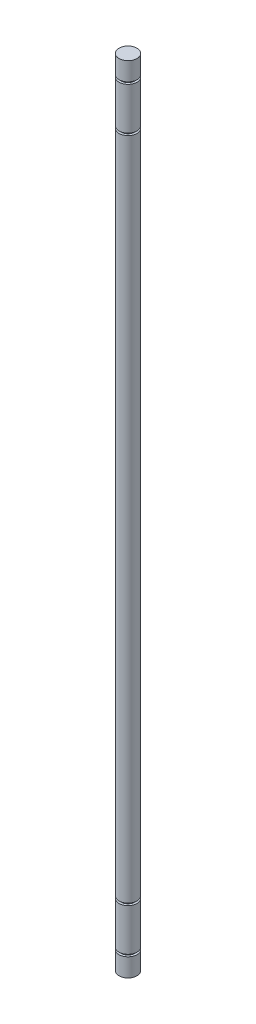
ISO-10303-21;
HEADER;
FILE_DESCRIPTION(('STEP AP214'),'2;1');
FILE_NAME('part.step','',(''),(''),'','','');
FILE_SCHEMA(('AUTOMOTIVE_DESIGN { 1 0 10303 214 1 1 1 1 }'));
ENDSEC;
DATA;
#1=APPLICATION_CONTEXT('core data for automotive mechanical design processes');
#2=APPLICATION_PROTOCOL_DEFINITION('international standard','automotive_design',2000,#1);
#3=PRODUCT_CONTEXT('',#1,'mechanical');
#4=PRODUCT('Part','Part','',(#3));
#5=PRODUCT_RELATED_PRODUCT_CATEGORY('part','',(#4));
#6=PRODUCT_DEFINITION_FORMATION('','',#4);
#7=PRODUCT_DEFINITION_CONTEXT('part definition',#1,'design');
#8=PRODUCT_DEFINITION('design','',#6,#7);
#9=PRODUCT_DEFINITION_SHAPE('','',#8);
#10=(LENGTH_UNIT() NAMED_UNIT(*) SI_UNIT(.MILLI.,.METRE.));
#11=(NAMED_UNIT(*) PLANE_ANGLE_UNIT() SI_UNIT($,.RADIAN.));
#12=(NAMED_UNIT(*) SI_UNIT($,.STERADIAN.) SOLID_ANGLE_UNIT());
#13=UNCERTAINTY_MEASURE_WITH_UNIT(LENGTH_MEASURE(1.E-05),#10,'distance_accuracy_value','');
#14=(GEOMETRIC_REPRESENTATION_CONTEXT(3) GLOBAL_UNCERTAINTY_ASSIGNED_CONTEXT((#13)) GLOBAL_UNIT_ASSIGNED_CONTEXT((#10,
#11,#12)) REPRESENTATION_CONTEXT('',''));
#15=CARTESIAN_POINT('',(0.,0.,0.));
#16=DIRECTION('',(0.,0.,1.));
#17=DIRECTION('',(1.,0.,0.));
#18=AXIS2_PLACEMENT_3D('',#15,#16,#17);
#19=CARTESIAN_POINT('',(0.,70.0659,0.));
#20=DIRECTION('',(0.,-1.,0.));
#21=DIRECTION('',(0.,0.,-1.));
#22=AXIS2_PLACEMENT_3D('',#19,#20,#21);
#23=CYLINDRICAL_SURFACE('',#22,1.5875);
#24=CARTESIAN_POINT('',(0.,-66.8274,0.));
#25=DIRECTION('',(0.,-1.,0.));
#26=DIRECTION('',(0.,0.,-1.));
#27=AXIS2_PLACEMENT_3D('',#24,#25,#26);
#28=CIRCLE('',#27,1.5875);
#29=CARTESIAN_POINT('',(0.,-66.8274,-1.5875));
#30=VERTEX_POINT('',#29);
#31=EDGE_CURVE('E77',#30,#30,#28,.T.);
#32=ORIENTED_EDGE('',*,*,#31,.T.);
#33=EDGE_LOOP('',(#32));
#34=FACE_BOUND('',#33,.T.);
#35=CARTESIAN_POINT('',(0.,-70.0659,0.));
#36=DIRECTION('',(0.,1.,0.));
#37=DIRECTION('',(0.,0.,1.));
#38=AXIS2_PLACEMENT_3D('',#35,#36,#37);
#39=CIRCLE('',#38,1.5875);
#40=CARTESIAN_POINT('',(0.,-70.0659,1.5875));
#41=VERTEX_POINT('',#40);
#42=EDGE_CURVE('E45',#41,#41,#39,.T.);
#43=ORIENTED_EDGE('',*,*,#42,.T.);
#44=EDGE_LOOP('',(#43));
#45=FACE_BOUND('',#44,.T.);
#46=ADVANCED_FACE('F41',(#34,#45),#23,.T.);
#47=CARTESIAN_POINT('',(0.,-70.0659,0.));
#48=DIRECTION('',(0.,1.,0.));
#49=DIRECTION('',(0.,0.,1.));
#50=AXIS2_PLACEMENT_3D('',#47,#48,#49);
#51=PLANE('',#50);
#52=ORIENTED_EDGE('',*,*,#42,.F.);
#53=EDGE_LOOP('',(#52));
#54=FACE_BOUND('',#53,.T.);
#55=ADVANCED_FACE('F167',(#54),#51,.F.);
#56=CARTESIAN_POINT('',(0.,-58.6232,0.));
#57=DIRECTION('',(0.,-1.,0.));
#58=DIRECTION('',(0.,0.,-1.));
#59=AXIS2_PLACEMENT_3D('',#56,#57,#58);
#60=CYLINDRICAL_SURFACE('',#59,1.2065);
#61=CARTESIAN_POINT('',(0.,-66.8274,0.));
#62=DIRECTION('',(0.,-1.,0.));
#63=DIRECTION('',(0.,0.,-1.));
#64=AXIS2_PLACEMENT_3D('',#61,#62,#63);
#65=CIRCLE('',#64,1.2065);
#66=CARTESIAN_POINT('',(0.,-66.8274,-1.2065));
#67=VERTEX_POINT('',#66);
#68=EDGE_CURVE('E72',#67,#67,#65,.T.);
#69=ORIENTED_EDGE('',*,*,#68,.F.);
#70=EDGE_LOOP('',(#69));
#71=FACE_BOUND('',#70,.T.);
#72=CARTESIAN_POINT('',(0.,-66.4464,0.));
#73=DIRECTION('',(0.,-1.,0.));
#74=DIRECTION('',(0.,0.,-1.));
#75=AXIS2_PLACEMENT_3D('',#72,#73,#74);
#76=CIRCLE('',#75,1.2065);
#77=CARTESIAN_POINT('',(0.,-66.4464,-1.2065));
#78=VERTEX_POINT('',#77);
#79=EDGE_CURVE('E85',#78,#78,#76,.T.);
#80=ORIENTED_EDGE('',*,*,#79,.T.);
#81=EDGE_LOOP('',(#80));
#82=FACE_BOUND('',#81,.T.);
#83=ADVANCED_FACE('F172',(#71,#82),#60,.T.);
#84=CARTESIAN_POINT('',(1.2065,-66.8274,0.));
#85=DIRECTION('',(0.,-1.,0.));
#86=DIRECTION('',(0.,0.,-1.));
#87=AXIS2_PLACEMENT_3D('',#84,#85,#86);
#88=PLANE('',#87);
#89=ORIENTED_EDGE('',*,*,#31,.F.);
#90=EDGE_LOOP('',(#89));
#91=FACE_BOUND('',#90,.T.);
#92=ORIENTED_EDGE('',*,*,#68,.T.);
#93=EDGE_LOOP('',(#92));
#94=FACE_BOUND('',#93,.T.);
#95=ADVANCED_FACE('F200',(#91,#94),#88,.F.);
#96=CARTESIAN_POINT('',(1.2065,-66.4464,0.));
#97=DIRECTION('',(0.,1.,0.));
#98=DIRECTION('',(0.,0.,1.));
#99=AXIS2_PLACEMENT_3D('',#96,#97,#98);
#100=PLANE('',#99);
#101=ORIENTED_EDGE('',*,*,#79,.F.);
#102=EDGE_LOOP('',(#101));
#103=FACE_BOUND('',#102,.T.);
#104=CARTESIAN_POINT('',(0.,-66.4464,0.));
#105=DIRECTION('',(0.,-1.,0.));
#106=DIRECTION('',(0.,0.,-1.));
#107=AXIS2_PLACEMENT_3D('',#104,#105,#106);
#108=CIRCLE('',#107,1.5875);
#109=CARTESIAN_POINT('',(0.,-66.4464,-1.5875));
#110=VERTEX_POINT('',#109);
#111=EDGE_CURVE('E81',#110,#110,#108,.T.);
#112=ORIENTED_EDGE('',*,*,#111,.T.);
#113=EDGE_LOOP('',(#112));
#114=FACE_BOUND('',#113,.T.);
#115=ADVANCED_FACE('F164',(#103,#114),#100,.F.);
#116=ORIENTED_EDGE('',*,*,#111,.F.);
#117=EDGE_LOOP('',(#116));
#118=FACE_BOUND('',#117,.T.);
#119=CARTESIAN_POINT('',(0.,-59.0042,0.));
#120=DIRECTION('',(0.,-1.,0.));
#121=DIRECTION('',(0.,0.,-1.));
#122=AXIS2_PLACEMENT_3D('',#119,#120,#121);
#123=CIRCLE('',#122,1.5875);
#124=CARTESIAN_POINT('',(0.,-59.0042,-1.5875));
#125=VERTEX_POINT('',#124);
#126=EDGE_CURVE('E108',#125,#125,#123,.T.);
#127=ORIENTED_EDGE('',*,*,#126,.T.);
#128=EDGE_LOOP('',(#127));
#129=FACE_BOUND('',#128,.T.);
#130=ADVANCED_FACE('F133',(#118,#129),#23,.T.);
#131=CARTESIAN_POINT('',(0.,-58.6232,0.));
#132=DIRECTION('',(0.,-1.,0.));
#133=DIRECTION('',(0.,0.,-1.));
#134=AXIS2_PLACEMENT_3D('',#131,#132,#133);
#135=CYLINDRICAL_SURFACE('',#134,1.2065);
#136=CARTESIAN_POINT('',(0.,-59.0042,0.));
#137=DIRECTION('',(0.,-1.,0.));
#138=DIRECTION('',(0.,0.,-1.));
#139=AXIS2_PLACEMENT_3D('',#136,#137,#138);
#140=CIRCLE('',#139,1.2065);
#141=CARTESIAN_POINT('',(0.,-59.0042,-1.2065));
#142=VERTEX_POINT('',#141);
#143=EDGE_CURVE('E71',#142,#142,#140,.T.);
#144=ORIENTED_EDGE('',*,*,#143,.F.);
#145=EDGE_LOOP('',(#144));
#146=FACE_BOUND('',#145,.T.);
#147=CARTESIAN_POINT('',(0.,-58.6232,0.));
#148=DIRECTION('',(0.,-1.,0.));
#149=DIRECTION('',(0.,0.,-1.));
#150=AXIS2_PLACEMENT_3D('',#147,#148,#149);
#151=CIRCLE('',#150,1.2065);
#152=CARTESIAN_POINT('',(0.,-58.6232,-1.2065));
#153=VERTEX_POINT('',#152);
#154=EDGE_CURVE('E93',#153,#153,#151,.T.);
#155=ORIENTED_EDGE('',*,*,#154,.T.);
#156=EDGE_LOOP('',(#155));
#157=FACE_BOUND('',#156,.T.);
#158=ADVANCED_FACE('F120',(#146,#157),#135,.T.);
#159=CARTESIAN_POINT('',(1.2065,-59.0042,0.));
#160=DIRECTION('',(0.,-1.,0.));
#161=DIRECTION('',(0.,0.,-1.));
#162=AXIS2_PLACEMENT_3D('',#159,#160,#161);
#163=PLANE('',#162);
#164=ORIENTED_EDGE('',*,*,#126,.F.);
#165=EDGE_LOOP('',(#164));
#166=FACE_BOUND('',#165,.T.);
#167=ORIENTED_EDGE('',*,*,#143,.T.);
#168=EDGE_LOOP('',(#167));
#169=FACE_BOUND('',#168,.T.);
#170=ADVANCED_FACE('F126',(#166,#169),#163,.F.);
#171=CARTESIAN_POINT('',(1.2065,-58.6232,0.));
#172=DIRECTION('',(0.,1.,0.));
#173=DIRECTION('',(0.,0.,1.));
#174=AXIS2_PLACEMENT_3D('',#171,#172,#173);
#175=PLANE('',#174);
#176=ORIENTED_EDGE('',*,*,#154,.F.);
#177=EDGE_LOOP('',(#176));
#178=FACE_BOUND('',#177,.T.);
#179=CARTESIAN_POINT('',(0.,-58.6232,0.));
#180=DIRECTION('',(0.,-1.,0.));
#181=DIRECTION('',(0.,0.,-1.));
#182=AXIS2_PLACEMENT_3D('',#179,#180,#181);
#183=CIRCLE('',#182,1.5875);
#184=CARTESIAN_POINT('',(0.,-58.6232,-1.5875));
#185=VERTEX_POINT('',#184);
#186=EDGE_CURVE('E112',#185,#185,#183,.T.);
#187=ORIENTED_EDGE('',*,*,#186,.T.);
#188=EDGE_LOOP('',(#187));
#189=FACE_BOUND('',#188,.T.);
#190=ADVANCED_FACE('F122',(#178,#189),#175,.F.);
#191=ORIENTED_EDGE('',*,*,#186,.F.);
#192=EDGE_LOOP('',(#191));
#193=FACE_BOUND('',#192,.T.);
#194=CARTESIAN_POINT('',(0.,58.6232,0.));
#195=DIRECTION('',(0.,-1.,0.));
#196=DIRECTION('',(0.,0.,-1.));
#197=AXIS2_PLACEMENT_3D('',#194,#195,#196);
#198=CIRCLE('',#197,1.5875);
#199=CARTESIAN_POINT('',(0.,58.6232,-1.5875));
#200=VERTEX_POINT('',#199);
#201=EDGE_CURVE('E59',#200,#200,#198,.T.);
#202=ORIENTED_EDGE('',*,*,#201,.T.);
#203=EDGE_LOOP('',(#202));
#204=FACE_BOUND('',#203,.T.);
#205=ADVANCED_FACE('F125',(#193,#204),#23,.T.);
#206=CARTESIAN_POINT('',(0.,-58.6232,0.));
#207=DIRECTION('',(0.,-1.,0.));
#208=DIRECTION('',(0.,0.,-1.));
#209=AXIS2_PLACEMENT_3D('',#206,#207,#208);
#210=CYLINDRICAL_SURFACE('',#209,1.20649999999999);
#211=CARTESIAN_POINT('',(0.,58.6232,0.));
#212=DIRECTION('',(0.,-1.,0.));
#213=DIRECTION('',(0.,0.,-1.));
#214=AXIS2_PLACEMENT_3D('',#211,#212,#213);
#215=CIRCLE('',#214,1.20649999999999);
#216=CARTESIAN_POINT('',(0.,58.6232,-1.20649999999999));
#217=VERTEX_POINT('',#216);
#218=EDGE_CURVE('E54',#217,#217,#215,.T.);
#219=ORIENTED_EDGE('',*,*,#218,.F.);
#220=EDGE_LOOP('',(#219));
#221=FACE_BOUND('',#220,.T.);
#222=CARTESIAN_POINT('',(0.,59.0042,0.));
#223=DIRECTION('',(0.,-1.,0.));
#224=DIRECTION('',(0.,0.,-1.));
#225=AXIS2_PLACEMENT_3D('',#222,#223,#224);
#226=CIRCLE('',#225,1.20649999999999);
#227=CARTESIAN_POINT('',(0.,59.0042,-1.20649999999999));
#228=VERTEX_POINT('',#227);
#229=EDGE_CURVE('E67',#228,#228,#226,.T.);
#230=ORIENTED_EDGE('',*,*,#229,.T.);
#231=EDGE_LOOP('',(#230));
#232=FACE_BOUND('',#231,.T.);
#233=ADVANCED_FACE('F132',(#221,#232),#210,.T.);
#234=CARTESIAN_POINT('',(1.20649999999999,58.6232,0.));
#235=DIRECTION('',(0.,-1.,0.));
#236=DIRECTION('',(0.,0.,-1.));
#237=AXIS2_PLACEMENT_3D('',#234,#235,#236);
#238=PLANE('',#237);
#239=ORIENTED_EDGE('',*,*,#201,.F.);
#240=EDGE_LOOP('',(#239));
#241=FACE_BOUND('',#240,.T.);
#242=ORIENTED_EDGE('',*,*,#218,.T.);
#243=EDGE_LOOP('',(#242));
#244=FACE_BOUND('',#243,.T.);
#245=ADVANCED_FACE('F136',(#241,#244),#238,.F.);
#246=CARTESIAN_POINT('',(1.20649999999999,59.0042,0.));
#247=DIRECTION('',(0.,1.,0.));
#248=DIRECTION('',(0.,0.,1.));
#249=AXIS2_PLACEMENT_3D('',#246,#247,#248);
#250=PLANE('',#249);
#251=ORIENTED_EDGE('',*,*,#229,.F.);
#252=EDGE_LOOP('',(#251));
#253=FACE_BOUND('',#252,.T.);
#254=CARTESIAN_POINT('',(0.,59.0042,0.));
#255=DIRECTION('',(0.,-1.,0.));
#256=DIRECTION('',(0.,0.,-1.));
#257=AXIS2_PLACEMENT_3D('',#254,#255,#256);
#258=CIRCLE('',#257,1.5875);
#259=CARTESIAN_POINT('',(0.,59.0042,-1.5875));
#260=VERTEX_POINT('',#259);
#261=EDGE_CURVE('E63',#260,#260,#258,.T.);
#262=ORIENTED_EDGE('',*,*,#261,.T.);
#263=EDGE_LOOP('',(#262));
#264=FACE_BOUND('',#263,.T.);
#265=ADVANCED_FACE('F139',(#253,#264),#250,.F.);
#266=CARTESIAN_POINT('',(0.,66.4464,0.));
#267=DIRECTION('',(0.,-1.,0.));
#268=DIRECTION('',(0.,0.,-1.));
#269=AXIS2_PLACEMENT_3D('',#266,#267,#268);
#270=CIRCLE('',#269,1.5875);
#271=CARTESIAN_POINT('',(0.,66.4464,-1.5875));
#272=VERTEX_POINT('',#271);
#273=EDGE_CURVE('E94',#272,#272,#270,.T.);
#274=ORIENTED_EDGE('',*,*,#273,.T.);
#275=EDGE_LOOP('',(#274));
#276=FACE_BOUND('',#275,.T.);
#277=ORIENTED_EDGE('',*,*,#261,.F.);
#278=EDGE_LOOP('',(#277));
#279=FACE_BOUND('',#278,.T.);
#280=ADVANCED_FACE('F150',(#276,#279),#23,.T.);
#281=CARTESIAN_POINT('',(0.,-58.6232,0.));
#282=DIRECTION('',(0.,-1.,0.));
#283=DIRECTION('',(0.,0.,-1.));
#284=AXIS2_PLACEMENT_3D('',#281,#282,#283);
#285=CYLINDRICAL_SURFACE('',#284,1.20649999999998);
#286=CARTESIAN_POINT('',(0.,66.4464,0.));
#287=DIRECTION('',(0.,-1.,0.));
#288=DIRECTION('',(0.,0.,-1.));
#289=AXIS2_PLACEMENT_3D('',#286,#287,#288);
#290=CIRCLE('',#289,1.20649999999998);
#291=CARTESIAN_POINT('',(0.,66.4464,-1.20649999999998));
#292=VERTEX_POINT('',#291);
#293=EDGE_CURVE('E89',#292,#292,#290,.T.);
#294=ORIENTED_EDGE('',*,*,#293,.F.);
#295=EDGE_LOOP('',(#294));
#296=FACE_BOUND('',#295,.T.);
#297=CARTESIAN_POINT('',(0.,66.8274,0.));
#298=DIRECTION('',(0.,-1.,0.));
#299=DIRECTION('',(0.,0.,-1.));
#300=AXIS2_PLACEMENT_3D('',#297,#298,#299);
#301=CIRCLE('',#300,1.20649999999998);
#302=CARTESIAN_POINT('',(0.,66.8274,-1.20649999999998));
#303=VERTEX_POINT('',#302);
#304=EDGE_CURVE('E76',#303,#303,#301,.T.);
#305=ORIENTED_EDGE('',*,*,#304,.T.);
#306=EDGE_LOOP('',(#305));
#307=FACE_BOUND('',#306,.T.);
#308=ADVANCED_FACE('F155',(#296,#307),#285,.T.);
#309=CARTESIAN_POINT('',(1.20649999999998,66.4464,0.));
#310=DIRECTION('',(0.,-1.,0.));
#311=DIRECTION('',(0.,0.,-1.));
#312=AXIS2_PLACEMENT_3D('',#309,#310,#311);
#313=PLANE('',#312);
#314=ORIENTED_EDGE('',*,*,#273,.F.);
#315=EDGE_LOOP('',(#314));
#316=FACE_BOUND('',#315,.T.);
#317=ORIENTED_EDGE('',*,*,#293,.T.);
#318=EDGE_LOOP('',(#317));
#319=FACE_BOUND('',#318,.T.);
#320=ADVANCED_FACE('F160',(#316,#319),#313,.F.);
#321=CARTESIAN_POINT('',(1.20649999999998,66.8274,0.));
#322=DIRECTION('',(0.,1.,0.));
#323=DIRECTION('',(0.,0.,1.));
#324=AXIS2_PLACEMENT_3D('',#321,#322,#323);
#325=PLANE('',#324);
#326=ORIENTED_EDGE('',*,*,#304,.F.);
#327=EDGE_LOOP('',(#326));
#328=FACE_BOUND('',#327,.T.);
#329=CARTESIAN_POINT('',(0.,66.8274,0.));
#330=DIRECTION('',(0.,-1.,0.));
#331=DIRECTION('',(0.,0.,-1.));
#332=AXIS2_PLACEMENT_3D('',#329,#330,#331);
#333=CIRCLE('',#332,1.5875);
#334=CARTESIAN_POINT('',(0.,66.8274,-1.5875));
#335=VERTEX_POINT('',#334);
#336=EDGE_CURVE('E98',#335,#335,#333,.T.);
#337=ORIENTED_EDGE('',*,*,#336,.T.);
#338=EDGE_LOOP('',(#337));
#339=FACE_BOUND('',#338,.T.);
#340=ADVANCED_FACE('F181',(#328,#339),#325,.F.);
#341=CARTESIAN_POINT('',(0.,70.0659,0.));
#342=DIRECTION('',(0.,1.,0.));
#343=DIRECTION('',(0.,0.,1.));
#344=AXIS2_PLACEMENT_3D('',#341,#342,#343);
#345=PLANE('',#344);
#346=CARTESIAN_POINT('',(0.,70.0659,0.));
#347=DIRECTION('',(0.,1.,0.));
#348=DIRECTION('',(0.,0.,1.));
#349=AXIS2_PLACEMENT_3D('',#346,#347,#348);
#350=CIRCLE('',#349,1.5875);
#351=CARTESIAN_POINT('',(0.,70.0659,1.5875));
#352=VERTEX_POINT('',#351);
#353=EDGE_CURVE('E10',#352,#352,#350,.T.);
#354=ORIENTED_EDGE('',*,*,#353,.T.);
#355=EDGE_LOOP('',(#354));
#356=FACE_BOUND('',#355,.T.);
#357=ADVANCED_FACE('F176',(#356),#345,.T.);
#358=ORIENTED_EDGE('',*,*,#336,.F.);
#359=EDGE_LOOP('',(#358));
#360=FACE_BOUND('',#359,.T.);
#361=ORIENTED_EDGE('',*,*,#353,.F.);
#362=EDGE_LOOP('',(#361));
#363=FACE_BOUND('',#362,.T.);
#364=ADVANCED_FACE('F43',(#360,#363),#23,.T.);
#365=CLOSED_SHELL('',(#46,#55,#83,#95,#115,#130,#158,#170,#190,#205,#233,#245,#265,#280,#308,
#320,#340,#357,#364));
#366=MANIFOLD_SOLID_BREP('B2',#365);
#367=ADVANCED_BREP_SHAPE_REPRESENTATION('',(#18,#366),#14);
#368=SHAPE_DEFINITION_REPRESENTATION(#9,#367);
ENDSEC;
END-ISO-10303-21;
